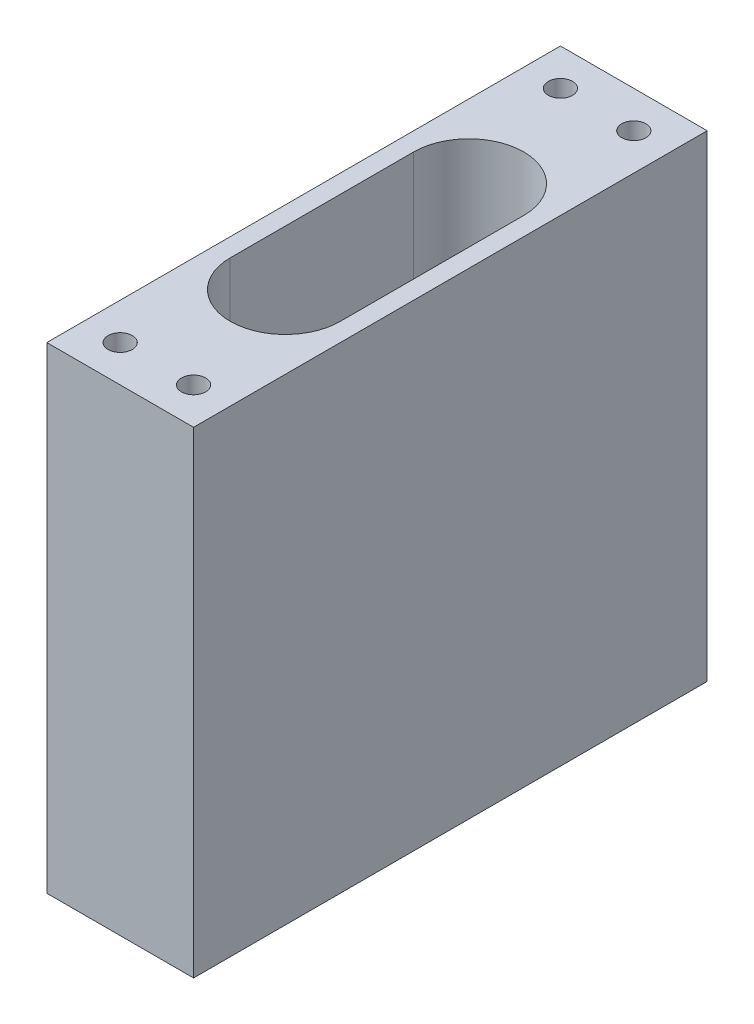
ISO-10303-21;
HEADER;
FILE_DESCRIPTION(('STEP AP214'),'2;1');
FILE_NAME('part.step','',(''),(''),'','','');
FILE_SCHEMA(('AUTOMOTIVE_DESIGN { 1 0 10303 214 1 1 1 1 }'));
ENDSEC;
DATA;
#1=APPLICATION_CONTEXT('core data for automotive mechanical design processes');
#2=APPLICATION_PROTOCOL_DEFINITION('international standard','automotive_design',2000,#1);
#3=PRODUCT_CONTEXT('',#1,'mechanical');
#4=PRODUCT('Part','Part','',(#3));
#5=PRODUCT_RELATED_PRODUCT_CATEGORY('part','',(#4));
#6=PRODUCT_DEFINITION_FORMATION('','',#4);
#7=PRODUCT_DEFINITION_CONTEXT('part definition',#1,'design');
#8=PRODUCT_DEFINITION('design','',#6,#7);
#9=PRODUCT_DEFINITION_SHAPE('','',#8);
#10=(LENGTH_UNIT() NAMED_UNIT(*) SI_UNIT(.MILLI.,.METRE.));
#11=(NAMED_UNIT(*) PLANE_ANGLE_UNIT() SI_UNIT($,.RADIAN.));
#12=(NAMED_UNIT(*) SI_UNIT($,.STERADIAN.) SOLID_ANGLE_UNIT());
#13=UNCERTAINTY_MEASURE_WITH_UNIT(LENGTH_MEASURE(1.E-05),#10,'distance_accuracy_value','');
#14=(GEOMETRIC_REPRESENTATION_CONTEXT(3) GLOBAL_UNCERTAINTY_ASSIGNED_CONTEXT((#13)) GLOBAL_UNIT_ASSIGNED_CONTEXT((#10,
#11,#12)) REPRESENTATION_CONTEXT('',''));
#15=CARTESIAN_POINT('',(0.,0.,0.));
#16=DIRECTION('',(0.,0.,1.));
#17=DIRECTION('',(1.,0.,0.));
#18=AXIS2_PLACEMENT_3D('',#15,#16,#17);
#19=CARTESIAN_POINT('',(-10.,32.5,35.));
#20=DIRECTION('',(1.,0.,0.));
#21=DIRECTION('',(0.,0.,-1.));
#22=AXIS2_PLACEMENT_3D('',#19,#20,#21);
#23=PLANE('',#22);
#24=DIRECTION('',(0.,0.,1.));
#25=VECTOR('',#24,1.);
#26=CARTESIAN_POINT('',(-10.,-32.5,35.));
#27=LINE('',#26,#25);
#28=CARTESIAN_POINT('',(-10.,-32.5,-35.));
#29=VERTEX_POINT('',#28);
#30=CARTESIAN_POINT('',(-10.,-32.5,35.));
#31=VERTEX_POINT('',#30);
#32=EDGE_CURVE('E137',#29,#31,#27,.T.);
#33=ORIENTED_EDGE('',*,*,#32,.T.);
#34=DIRECTION('',(0.,-1.,0.));
#35=VECTOR('',#34,1.);
#36=CARTESIAN_POINT('',(-10.,32.5,35.));
#37=LINE('',#36,#35);
#38=CARTESIAN_POINT('',(-10.,32.5,35.));
#39=VERTEX_POINT('',#38);
#40=EDGE_CURVE('E11',#39,#31,#37,.T.);
#41=ORIENTED_EDGE('',*,*,#40,.F.);
#42=DIRECTION('',(0.,0.,1.));
#43=VECTOR('',#42,1.);
#44=CARTESIAN_POINT('',(-10.,32.5,35.));
#45=LINE('',#44,#43);
#46=CARTESIAN_POINT('',(-10.,32.5,-35.));
#47=VERTEX_POINT('',#46);
#48=EDGE_CURVE('E141',#47,#39,#45,.T.);
#49=ORIENTED_EDGE('',*,*,#48,.F.);
#50=DIRECTION('',(0.,-1.,0.));
#51=VECTOR('',#50,1.);
#52=CARTESIAN_POINT('',(-10.,32.5,-35.));
#53=LINE('',#52,#51);
#54=EDGE_CURVE('E151',#47,#29,#53,.T.);
#55=ORIENTED_EDGE('',*,*,#54,.T.);
#56=EDGE_LOOP('',(#33,#41,#49,#55));
#57=FACE_BOUND('',#56,.T.);
#58=ADVANCED_FACE('F34',(#57),#23,.F.);
#59=CARTESIAN_POINT('',(10.,32.5,35.));
#60=DIRECTION('',(0.,0.,-1.));
#61=DIRECTION('',(-1.,0.,0.));
#62=AXIS2_PLACEMENT_3D('',#59,#60,#61);
#63=PLANE('',#62);
#64=DIRECTION('',(1.,0.,0.));
#65=VECTOR('',#64,1.);
#66=CARTESIAN_POINT('',(10.,-32.5,35.));
#67=LINE('',#66,#65);
#68=CARTESIAN_POINT('',(10.,-32.5,35.));
#69=VERTEX_POINT('',#68);
#70=EDGE_CURVE('E154',#31,#69,#67,.T.);
#71=ORIENTED_EDGE('',*,*,#70,.T.);
#72=DIRECTION('',(0.,-1.,0.));
#73=VECTOR('',#72,1.);
#74=CARTESIAN_POINT('',(10.,32.5,35.));
#75=LINE('',#74,#73);
#76=CARTESIAN_POINT('',(10.,32.5,35.));
#77=VERTEX_POINT('',#76);
#78=EDGE_CURVE('E42',#77,#69,#75,.T.);
#79=ORIENTED_EDGE('',*,*,#78,.F.);
#80=DIRECTION('',(1.,0.,0.));
#81=VECTOR('',#80,1.);
#82=CARTESIAN_POINT('',(10.,32.5,35.));
#83=LINE('',#82,#81);
#84=EDGE_CURVE('E144',#39,#77,#83,.T.);
#85=ORIENTED_EDGE('',*,*,#84,.F.);
#86=ORIENTED_EDGE('',*,*,#40,.T.);
#87=EDGE_LOOP('',(#71,#79,#85,#86));
#88=FACE_BOUND('',#87,.T.);
#89=ADVANCED_FACE('F229',(#88),#63,.F.);
#90=CARTESIAN_POINT('',(10.,32.5,35.));
#91=DIRECTION('',(-1.,0.,0.));
#92=DIRECTION('',(0.,0.,1.));
#93=AXIS2_PLACEMENT_3D('',#90,#91,#92);
#94=PLANE('',#93);
#95=DIRECTION('',(0.,0.,-1.));
#96=VECTOR('',#95,1.);
#97=CARTESIAN_POINT('',(10.,-32.5,35.));
#98=LINE('',#97,#96);
#99=CARTESIAN_POINT('',(10.,-32.5,-35.));
#100=VERTEX_POINT('',#99);
#101=EDGE_CURVE('E156',#69,#100,#98,.T.);
#102=ORIENTED_EDGE('',*,*,#101,.T.);
#103=DIRECTION('',(0.,-1.,0.));
#104=VECTOR('',#103,1.);
#105=CARTESIAN_POINT('',(10.,32.5,-35.));
#106=LINE('',#105,#104);
#107=CARTESIAN_POINT('',(10.,32.5,-35.));
#108=VERTEX_POINT('',#107);
#109=EDGE_CURVE('E161',#108,#100,#106,.T.);
#110=ORIENTED_EDGE('',*,*,#109,.F.);
#111=DIRECTION('',(0.,0.,-1.));
#112=VECTOR('',#111,1.);
#113=CARTESIAN_POINT('',(10.,32.5,35.));
#114=LINE('',#113,#112);
#115=EDGE_CURVE('E147',#77,#108,#114,.T.);
#116=ORIENTED_EDGE('',*,*,#115,.F.);
#117=ORIENTED_EDGE('',*,*,#78,.T.);
#118=EDGE_LOOP('',(#102,#110,#116,#117));
#119=FACE_BOUND('',#118,.T.);
#120=ADVANCED_FACE('F226',(#119),#94,.F.);
#121=CARTESIAN_POINT('',(10.,32.5,-35.));
#122=DIRECTION('',(0.,0.,1.));
#123=DIRECTION('',(1.,0.,0.));
#124=AXIS2_PLACEMENT_3D('',#121,#122,#123);
#125=PLANE('',#124);
#126=DIRECTION('',(-1.,0.,0.));
#127=VECTOR('',#126,1.);
#128=CARTESIAN_POINT('',(10.,-32.5,-35.));
#129=LINE('',#128,#127);
#130=EDGE_CURVE('E145',#100,#29,#129,.T.);
#131=ORIENTED_EDGE('',*,*,#130,.T.);
#132=ORIENTED_EDGE('',*,*,#54,.F.);
#133=DIRECTION('',(-1.,0.,0.));
#134=VECTOR('',#133,1.);
#135=CARTESIAN_POINT('',(10.,32.5,-35.));
#136=LINE('',#135,#134);
#137=EDGE_CURVE('E149',#108,#47,#136,.T.);
#138=ORIENTED_EDGE('',*,*,#137,.F.);
#139=ORIENTED_EDGE('',*,*,#109,.T.);
#140=EDGE_LOOP('',(#131,#132,#138,#139));
#141=FACE_BOUND('',#140,.T.);
#142=ADVANCED_FACE('F193',(#141),#125,.F.);
#143=CARTESIAN_POINT('',(-10.,32.5,-35.));
#144=DIRECTION('',(0.,1.,0.));
#145=DIRECTION('',(0.,0.,1.));
#146=AXIS2_PLACEMENT_3D('',#143,#144,#145);
#147=PLANE('',#146);
#148=CARTESIAN_POINT('',(-5.,32.5,30.));
#149=DIRECTION('',(0.,1.,0.));
#150=DIRECTION('',(0.,0.,1.));
#151=AXIS2_PLACEMENT_3D('',#148,#149,#150);
#152=CIRCLE('',#151,1.65);
#153=CARTESIAN_POINT('',(-5.,32.5,31.65));
#154=VERTEX_POINT('',#153);
#155=EDGE_CURVE('E182',#154,#154,#152,.T.);
#156=ORIENTED_EDGE('',*,*,#155,.F.);
#157=EDGE_LOOP('',(#156));
#158=FACE_BOUND('',#157,.T.);
#159=CARTESIAN_POINT('',(5.,32.5,30.));
#160=DIRECTION('',(0.,1.,0.));
#161=DIRECTION('',(0.,0.,1.));
#162=AXIS2_PLACEMENT_3D('',#159,#160,#161);
#163=CIRCLE('',#162,1.65);
#164=CARTESIAN_POINT('',(5.,32.5,31.65));
#165=VERTEX_POINT('',#164);
#166=EDGE_CURVE('E173',#165,#165,#163,.T.);
#167=ORIENTED_EDGE('',*,*,#166,.F.);
#168=EDGE_LOOP('',(#167));
#169=FACE_BOUND('',#168,.T.);
#170=CARTESIAN_POINT('',(5.,32.5,-30.));
#171=DIRECTION('',(0.,1.,0.));
#172=DIRECTION('',(0.,0.,1.));
#173=AXIS2_PLACEMENT_3D('',#170,#171,#172);
#174=CIRCLE('',#173,1.65);
#175=CARTESIAN_POINT('',(5.,32.5,-28.35));
#176=VERTEX_POINT('',#175);
#177=EDGE_CURVE('E170',#176,#176,#174,.T.);
#178=ORIENTED_EDGE('',*,*,#177,.F.);
#179=EDGE_LOOP('',(#178));
#180=FACE_BOUND('',#179,.T.);
#181=CARTESIAN_POINT('',(-5.,32.5,-30.));
#182=DIRECTION('',(0.,1.,0.));
#183=DIRECTION('',(0.,0.,1.));
#184=AXIS2_PLACEMENT_3D('',#181,#182,#183);
#185=CIRCLE('',#184,1.65);
#186=CARTESIAN_POINT('',(-5.,32.5,-28.35));
#187=VERTEX_POINT('',#186);
#188=EDGE_CURVE('E124',#187,#187,#185,.T.);
#189=ORIENTED_EDGE('',*,*,#188,.F.);
#190=EDGE_LOOP('',(#189));
#191=FACE_BOUND('',#190,.T.);
#192=CARTESIAN_POINT('',(0.,32.5,-12.5));
#193=DIRECTION('',(0.,-1.,0.));
#194=DIRECTION('',(0.,0.,-1.));
#195=AXIS2_PLACEMENT_3D('',#192,#193,#194);
#196=CIRCLE('',#195,7.5);
#197=CARTESIAN_POINT('',(-7.5,32.5,-12.5));
#198=VERTEX_POINT('',#197);
#199=CARTESIAN_POINT('',(7.5,32.5,-12.5));
#200=VERTEX_POINT('',#199);
#201=EDGE_CURVE('E102',#198,#200,#196,.T.);
#202=ORIENTED_EDGE('',*,*,#201,.T.);
#203=DIRECTION('',(0.,0.,1.));
#204=VECTOR('',#203,1.);
#205=CARTESIAN_POINT('',(7.5,32.5,-12.5));
#206=LINE('',#205,#204);
#207=CARTESIAN_POINT('',(7.5,32.5,12.5));
#208=VERTEX_POINT('',#207);
#209=EDGE_CURVE('E111',#200,#208,#206,.T.);
#210=ORIENTED_EDGE('',*,*,#209,.T.);
#211=CARTESIAN_POINT('',(0.,32.5,12.5));
#212=DIRECTION('',(0.,-1.,0.));
#213=DIRECTION('',(0.,0.,-1.));
#214=AXIS2_PLACEMENT_3D('',#211,#212,#213);
#215=CIRCLE('',#214,7.5);
#216=CARTESIAN_POINT('',(-7.5,32.5,12.5));
#217=VERTEX_POINT('',#216);
#218=EDGE_CURVE('E50',#208,#217,#215,.T.);
#219=ORIENTED_EDGE('',*,*,#218,.T.);
#220=DIRECTION('',(0.,0.,-1.));
#221=VECTOR('',#220,1.);
#222=CARTESIAN_POINT('',(-7.5,32.5,-12.5));
#223=LINE('',#222,#221);
#224=EDGE_CURVE('E108',#217,#198,#223,.T.);
#225=ORIENTED_EDGE('',*,*,#224,.T.);
#226=EDGE_LOOP('',(#202,#210,#219,#225));
#227=FACE_BOUND('',#226,.T.);
#228=ORIENTED_EDGE('',*,*,#48,.T.);
#229=ORIENTED_EDGE('',*,*,#84,.T.);
#230=ORIENTED_EDGE('',*,*,#115,.T.);
#231=ORIENTED_EDGE('',*,*,#137,.T.);
#232=EDGE_LOOP('',(#228,#229,#230,#231));
#233=FACE_BOUND('',#232,.T.);
#234=ADVANCED_FACE('F115',(#158,#169,#180,#191,#227,#233),#147,.T.);
#235=CARTESIAN_POINT('',(-10.,-32.5,-35.));
#236=DIRECTION('',(0.,1.,0.));
#237=DIRECTION('',(0.,0.,1.));
#238=AXIS2_PLACEMENT_3D('',#235,#236,#237);
#239=PLANE('',#238);
#240=CARTESIAN_POINT('',(-5.,-32.5,30.));
#241=DIRECTION('',(0.,1.,0.));
#242=DIRECTION('',(0.,0.,1.));
#243=AXIS2_PLACEMENT_3D('',#240,#241,#242);
#244=CIRCLE('',#243,1.64999999999999);
#245=CARTESIAN_POINT('',(-5.,-32.5,31.65));
#246=VERTEX_POINT('',#245);
#247=EDGE_CURVE('E37',#246,#246,#244,.T.);
#248=ORIENTED_EDGE('',*,*,#247,.T.);
#249=EDGE_LOOP('',(#248));
#250=FACE_BOUND('',#249,.T.);
#251=CARTESIAN_POINT('',(5.,-32.5,30.));
#252=DIRECTION('',(0.,1.,0.));
#253=DIRECTION('',(0.,0.,1.));
#254=AXIS2_PLACEMENT_3D('',#251,#252,#253);
#255=CIRCLE('',#254,1.64999999999999);
#256=CARTESIAN_POINT('',(5.,-32.5,31.65));
#257=VERTEX_POINT('',#256);
#258=EDGE_CURVE('E171',#257,#257,#255,.T.);
#259=ORIENTED_EDGE('',*,*,#258,.T.);
#260=EDGE_LOOP('',(#259));
#261=FACE_BOUND('',#260,.T.);
#262=CARTESIAN_POINT('',(5.,-32.5,-30.));
#263=DIRECTION('',(0.,1.,0.));
#264=DIRECTION('',(0.,0.,1.));
#265=AXIS2_PLACEMENT_3D('',#262,#263,#264);
#266=CIRCLE('',#265,1.64999999999999);
#267=CARTESIAN_POINT('',(5.,-32.5,-28.35));
#268=VERTEX_POINT('',#267);
#269=EDGE_CURVE('E168',#268,#268,#266,.T.);
#270=ORIENTED_EDGE('',*,*,#269,.T.);
#271=EDGE_LOOP('',(#270));
#272=FACE_BOUND('',#271,.T.);
#273=CARTESIAN_POINT('',(-5.,-32.5,-30.));
#274=DIRECTION('',(0.,1.,0.));
#275=DIRECTION('',(0.,0.,1.));
#276=AXIS2_PLACEMENT_3D('',#273,#274,#275);
#277=CIRCLE('',#276,1.64999999999999);
#278=CARTESIAN_POINT('',(-5.,-32.5,-28.35));
#279=VERTEX_POINT('',#278);
#280=EDGE_CURVE('E131',#279,#279,#277,.T.);
#281=ORIENTED_EDGE('',*,*,#280,.T.);
#282=EDGE_LOOP('',(#281));
#283=FACE_BOUND('',#282,.T.);
#284=DIRECTION('',(0.,0.,1.));
#285=VECTOR('',#284,1.);
#286=CARTESIAN_POINT('',(7.5,-32.5,-12.5));
#287=LINE('',#286,#285);
#288=CARTESIAN_POINT('',(7.5,-32.5,-12.5));
#289=VERTEX_POINT('',#288);
#290=CARTESIAN_POINT('',(7.5,-32.5,12.5));
#291=VERTEX_POINT('',#290);
#292=EDGE_CURVE('E130',#289,#291,#287,.T.);
#293=ORIENTED_EDGE('',*,*,#292,.F.);
#294=CARTESIAN_POINT('',(0.,-32.5,-12.5));
#295=DIRECTION('',(0.,-1.,0.));
#296=DIRECTION('',(0.,0.,-1.));
#297=AXIS2_PLACEMENT_3D('',#294,#295,#296);
#298=CIRCLE('',#297,7.5);
#299=CARTESIAN_POINT('',(-7.5,-32.5,-12.5));
#300=VERTEX_POINT('',#299);
#301=EDGE_CURVE('E58',#300,#289,#298,.T.);
#302=ORIENTED_EDGE('',*,*,#301,.F.);
#303=DIRECTION('',(0.,0.,-1.));
#304=VECTOR('',#303,1.);
#305=CARTESIAN_POINT('',(-7.5,-32.5,-12.5));
#306=LINE('',#305,#304);
#307=CARTESIAN_POINT('',(-7.5,-32.5,12.5));
#308=VERTEX_POINT('',#307);
#309=EDGE_CURVE('E118',#308,#300,#306,.T.);
#310=ORIENTED_EDGE('',*,*,#309,.F.);
#311=CARTESIAN_POINT('',(0.,-32.5,12.5));
#312=DIRECTION('',(0.,-1.,0.));
#313=DIRECTION('',(0.,0.,-1.));
#314=AXIS2_PLACEMENT_3D('',#311,#312,#313);
#315=CIRCLE('',#314,7.5);
#316=EDGE_CURVE('E121',#291,#308,#315,.T.);
#317=ORIENTED_EDGE('',*,*,#316,.F.);
#318=EDGE_LOOP('',(#293,#302,#310,#317));
#319=FACE_BOUND('',#318,.T.);
#320=ORIENTED_EDGE('',*,*,#32,.F.);
#321=ORIENTED_EDGE('',*,*,#130,.F.);
#322=ORIENTED_EDGE('',*,*,#101,.F.);
#323=ORIENTED_EDGE('',*,*,#70,.F.);
#324=EDGE_LOOP('',(#320,#321,#322,#323));
#325=FACE_BOUND('',#324,.T.);
#326=ADVANCED_FACE('F192',(#250,#261,#272,#283,#319,#325),#239,.F.);
#327=CARTESIAN_POINT('',(0.,32.5,-12.5));
#328=DIRECTION('',(0.,-1.,0.));
#329=DIRECTION('',(0.,0.,-1.));
#330=AXIS2_PLACEMENT_3D('',#327,#328,#329);
#331=CYLINDRICAL_SURFACE('',#330,7.5);
#332=ORIENTED_EDGE('',*,*,#301,.T.);
#333=DIRECTION('',(0.,-1.,0.));
#334=VECTOR('',#333,1.);
#335=CARTESIAN_POINT('',(7.5,32.5,-12.5));
#336=LINE('',#335,#334);
#337=EDGE_CURVE('E98',#200,#289,#336,.T.);
#338=ORIENTED_EDGE('',*,*,#337,.F.);
#339=ORIENTED_EDGE('',*,*,#201,.F.);
#340=DIRECTION('',(0.,-1.,0.));
#341=VECTOR('',#340,1.);
#342=CARTESIAN_POINT('',(-7.5,32.5,-12.5));
#343=LINE('',#342,#341);
#344=EDGE_CURVE('E135',#198,#300,#343,.T.);
#345=ORIENTED_EDGE('',*,*,#344,.T.);
#346=EDGE_LOOP('',(#332,#338,#339,#345));
#347=FACE_BOUND('',#346,.T.);
#348=ADVANCED_FACE('F100',(#347),#331,.F.);
#349=CARTESIAN_POINT('',(-7.5,32.5,-12.5));
#350=DIRECTION('',(-1.,0.,0.));
#351=DIRECTION('',(0.,0.,1.));
#352=AXIS2_PLACEMENT_3D('',#349,#350,#351);
#353=PLANE('',#352);
#354=ORIENTED_EDGE('',*,*,#309,.T.);
#355=ORIENTED_EDGE('',*,*,#344,.F.);
#356=ORIENTED_EDGE('',*,*,#224,.F.);
#357=DIRECTION('',(0.,-1.,0.));
#358=VECTOR('',#357,1.);
#359=CARTESIAN_POINT('',(-7.5,32.5,12.5));
#360=LINE('',#359,#358);
#361=EDGE_CURVE('E138',#217,#308,#360,.T.);
#362=ORIENTED_EDGE('',*,*,#361,.T.);
#363=EDGE_LOOP('',(#354,#355,#356,#362));
#364=FACE_BOUND('',#363,.T.);
#365=ADVANCED_FACE('F241',(#364),#353,.F.);
#366=CARTESIAN_POINT('',(0.,32.5,12.5));
#367=DIRECTION('',(0.,-1.,0.));
#368=DIRECTION('',(0.,0.,-1.));
#369=AXIS2_PLACEMENT_3D('',#366,#367,#368);
#370=CYLINDRICAL_SURFACE('',#369,7.5);
#371=ORIENTED_EDGE('',*,*,#316,.T.);
#372=ORIENTED_EDGE('',*,*,#361,.F.);
#373=ORIENTED_EDGE('',*,*,#218,.F.);
#374=DIRECTION('',(0.,-1.,0.));
#375=VECTOR('',#374,1.);
#376=CARTESIAN_POINT('',(7.5,32.5,12.5));
#377=LINE('',#376,#375);
#378=EDGE_CURVE('E107',#208,#291,#377,.T.);
#379=ORIENTED_EDGE('',*,*,#378,.T.);
#380=EDGE_LOOP('',(#371,#372,#373,#379));
#381=FACE_BOUND('',#380,.T.);
#382=ADVANCED_FACE('F244',(#381),#370,.F.);
#383=CARTESIAN_POINT('',(7.5,32.5,-12.5));
#384=DIRECTION('',(1.,0.,0.));
#385=DIRECTION('',(0.,0.,-1.));
#386=AXIS2_PLACEMENT_3D('',#383,#384,#385);
#387=PLANE('',#386);
#388=ORIENTED_EDGE('',*,*,#292,.T.);
#389=ORIENTED_EDGE('',*,*,#378,.F.);
#390=ORIENTED_EDGE('',*,*,#209,.F.);
#391=ORIENTED_EDGE('',*,*,#337,.T.);
#392=EDGE_LOOP('',(#388,#389,#390,#391));
#393=FACE_BOUND('',#392,.T.);
#394=ADVANCED_FACE('F112',(#393),#387,.F.);
#395=CARTESIAN_POINT('',(-5.,32.5,-30.));
#396=DIRECTION('',(0.,1.,0.));
#397=DIRECTION('',(0.,0.,1.));
#398=AXIS2_PLACEMENT_3D('',#395,#396,#397);
#399=CYLINDRICAL_SURFACE('',#398,1.64999999999999);
#400=ORIENTED_EDGE('',*,*,#188,.T.);
#401=EDGE_LOOP('',(#400));
#402=FACE_BOUND('',#401,.T.);
#403=ORIENTED_EDGE('',*,*,#280,.F.);
#404=EDGE_LOOP('',(#403));
#405=FACE_BOUND('',#404,.T.);
#406=ADVANCED_FACE('F201',(#402,#405),#399,.F.);
#407=CARTESIAN_POINT('',(5.,32.5,-30.));
#408=DIRECTION('',(0.,1.,0.));
#409=DIRECTION('',(0.,0.,1.));
#410=AXIS2_PLACEMENT_3D('',#407,#408,#409);
#411=CYLINDRICAL_SURFACE('',#410,1.64999999999999);
#412=ORIENTED_EDGE('',*,*,#177,.T.);
#413=EDGE_LOOP('',(#412));
#414=FACE_BOUND('',#413,.T.);
#415=ORIENTED_EDGE('',*,*,#269,.F.);
#416=EDGE_LOOP('',(#415));
#417=FACE_BOUND('',#416,.T.);
#418=ADVANCED_FACE('F204',(#414,#417),#411,.F.);
#419=CARTESIAN_POINT('',(5.,32.5,30.));
#420=DIRECTION('',(0.,1.,0.));
#421=DIRECTION('',(0.,0.,1.));
#422=AXIS2_PLACEMENT_3D('',#419,#420,#421);
#423=CYLINDRICAL_SURFACE('',#422,1.64999999999999);
#424=ORIENTED_EDGE('',*,*,#166,.T.);
#425=EDGE_LOOP('',(#424));
#426=FACE_BOUND('',#425,.T.);
#427=ORIENTED_EDGE('',*,*,#258,.F.);
#428=EDGE_LOOP('',(#427));
#429=FACE_BOUND('',#428,.T.);
#430=ADVANCED_FACE('F252',(#426,#429),#423,.F.);
#431=CARTESIAN_POINT('',(-5.,32.5,30.));
#432=DIRECTION('',(0.,1.,0.));
#433=DIRECTION('',(0.,0.,1.));
#434=AXIS2_PLACEMENT_3D('',#431,#432,#433);
#435=CYLINDRICAL_SURFACE('',#434,1.64999999999999);
#436=ORIENTED_EDGE('',*,*,#155,.T.);
#437=EDGE_LOOP('',(#436));
#438=FACE_BOUND('',#437,.T.);
#439=ORIENTED_EDGE('',*,*,#247,.F.);
#440=EDGE_LOOP('',(#439));
#441=FACE_BOUND('',#440,.T.);
#442=ADVANCED_FACE('F187',(#438,#441),#435,.F.);
#443=CLOSED_SHELL('',(#58,#89,#120,#142,#234,#326,#348,#365,#382,#394,#406,#418,#430,#442));
#444=MANIFOLD_SOLID_BREP('B2',#443);
#445=ADVANCED_BREP_SHAPE_REPRESENTATION('',(#18,#444),#14);
#446=SHAPE_DEFINITION_REPRESENTATION(#9,#445);
ENDSEC;
END-ISO-10303-21;
